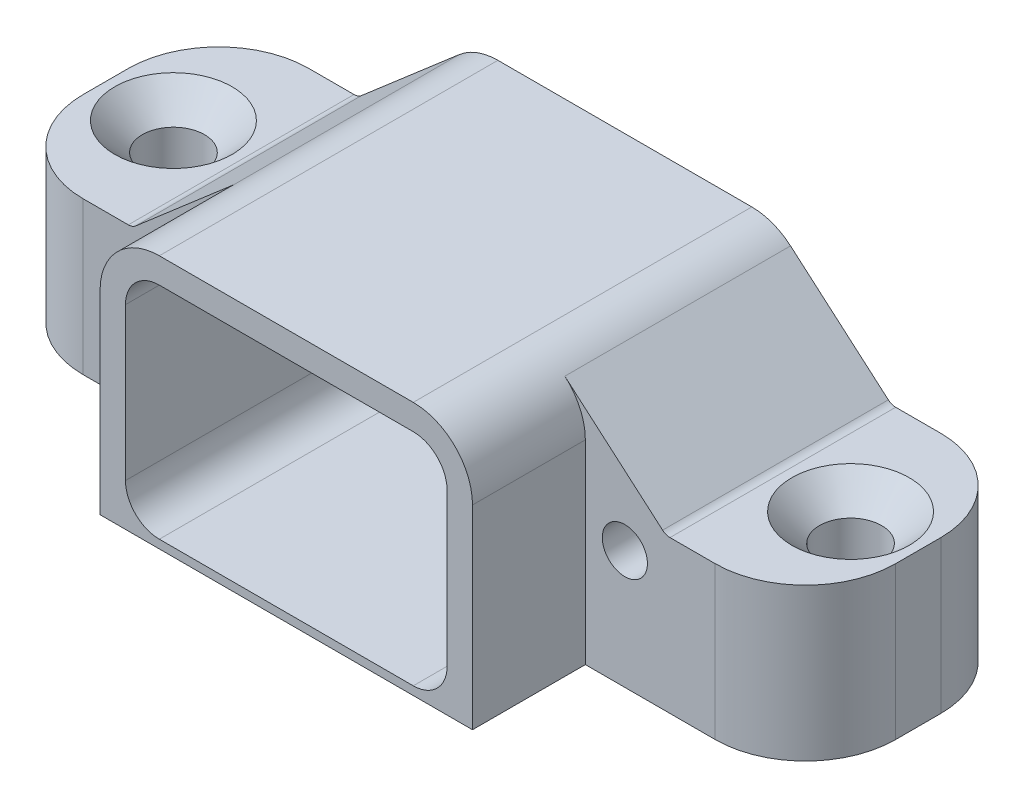
ISO-10303-21;
HEADER;
FILE_DESCRIPTION(('STEP AP214'),'2;1');
FILE_NAME('part.step','',(''),(''),'','','');
FILE_SCHEMA(('AUTOMOTIVE_DESIGN { 1 0 10303 214 1 1 1 1 }'));
ENDSEC;
DATA;
#1=APPLICATION_CONTEXT('core data for automotive mechanical design processes');
#2=APPLICATION_PROTOCOL_DEFINITION('international standard','automotive_design',2000,#1);
#3=PRODUCT_CONTEXT('',#1,'mechanical');
#4=PRODUCT('Part','Part','',(#3));
#5=PRODUCT_RELATED_PRODUCT_CATEGORY('part','',(#4));
#6=PRODUCT_DEFINITION_FORMATION('','',#4);
#7=PRODUCT_DEFINITION_CONTEXT('part definition',#1,'design');
#8=PRODUCT_DEFINITION('design','',#6,#7);
#9=PRODUCT_DEFINITION_SHAPE('','',#8);
#10=(LENGTH_UNIT() NAMED_UNIT(*) SI_UNIT(.MILLI.,.METRE.));
#11=(NAMED_UNIT(*) PLANE_ANGLE_UNIT() SI_UNIT($,.RADIAN.));
#12=(NAMED_UNIT(*) SI_UNIT($,.STERADIAN.) SOLID_ANGLE_UNIT());
#13=UNCERTAINTY_MEASURE_WITH_UNIT(LENGTH_MEASURE(1.E-05),#10,'distance_accuracy_value','');
#14=(GEOMETRIC_REPRESENTATION_CONTEXT(3) GLOBAL_UNCERTAINTY_ASSIGNED_CONTEXT((#13)) GLOBAL_UNIT_ASSIGNED_CONTEXT((#10,
#11,#12)) REPRESENTATION_CONTEXT('',''));
#15=CARTESIAN_POINT('',(0.,0.,0.));
#16=DIRECTION('',(0.,0.,1.));
#17=DIRECTION('',(1.,0.,0.));
#18=AXIS2_PLACEMENT_3D('',#15,#16,#17);
#19=CARTESIAN_POINT('',(0.,-10.5,20.));
#20=DIRECTION('',(0.,-1.,0.));
#21=DIRECTION('',(1.,0.,0.));
#22=AXIS2_PLACEMENT_3D('',#19,#20,#21);
#23=PLANE('',#22);
#24=DIRECTION('',(-1.,0.,0.));
#25=VECTOR('',#24,1.);
#26=CARTESIAN_POINT('',(0.,-10.5,20.));
#27=LINE('',#26,#25);
#28=CARTESIAN_POINT('',(-16.5,-10.5,20.));
#29=VERTEX_POINT('',#28);
#30=CARTESIAN_POINT('',(-28.,-10.5,20.));
#31=VERTEX_POINT('',#30);
#32=EDGE_CURVE('E417',#29,#31,#27,.T.);
#33=ORIENTED_EDGE('',*,*,#32,.T.);
#34=CARTESIAN_POINT('',(-28.,-10.5,12.));
#35=DIRECTION('',(0.,-1.,0.));
#36=DIRECTION('',(1.,0.,0.));
#37=AXIS2_PLACEMENT_3D('',#34,#35,#36);
#38=CIRCLE('',#37,8.);
#39=CARTESIAN_POINT('',(-36.,-10.5,12.));
#40=VERTEX_POINT('',#39);
#41=EDGE_CURVE('E49',#31,#40,#38,.T.);
#42=ORIENTED_EDGE('',*,*,#41,.T.);
#43=DIRECTION('',(0.,0.,-1.));
#44=VECTOR('',#43,1.);
#45=CARTESIAN_POINT('',(-36.,-10.5,20.));
#46=LINE('',#45,#44);
#47=CARTESIAN_POINT('',(-36.,-10.5,8.));
#48=VERTEX_POINT('',#47);
#49=EDGE_CURVE('E457',#40,#48,#46,.T.);
#50=ORIENTED_EDGE('',*,*,#49,.T.);
#51=CARTESIAN_POINT('',(-28.,-10.5,8.));
#52=DIRECTION('',(0.,-1.,0.));
#53=DIRECTION('',(1.,0.,0.));
#54=AXIS2_PLACEMENT_3D('',#51,#52,#53);
#55=CIRCLE('',#54,8.);
#56=CARTESIAN_POINT('',(-28.,-10.5,0.));
#57=VERTEX_POINT('',#56);
#58=EDGE_CURVE('E56',#48,#57,#55,.T.);
#59=ORIENTED_EDGE('',*,*,#58,.T.);
#60=DIRECTION('',(-1.,0.,0.));
#61=VECTOR('',#60,1.);
#62=CARTESIAN_POINT('',(0.,-10.5,0.));
#63=LINE('',#62,#61);
#64=CARTESIAN_POINT('',(28.,-10.5,0.));
#65=VERTEX_POINT('',#64);
#66=EDGE_CURVE('E436',#65,#57,#63,.T.);
#67=ORIENTED_EDGE('',*,*,#66,.F.);
#68=CARTESIAN_POINT('',(28.,-10.5,8.));
#69=DIRECTION('',(0.,1.,0.));
#70=DIRECTION('',(-1.,0.,0.));
#71=AXIS2_PLACEMENT_3D('',#68,#69,#70);
#72=CIRCLE('',#71,8.);
#73=CARTESIAN_POINT('',(36.,-10.5,8.));
#74=VERTEX_POINT('',#73);
#75=EDGE_CURVE('E353',#74,#65,#72,.T.);
#76=ORIENTED_EDGE('',*,*,#75,.F.);
#77=DIRECTION('',(0.,0.,-1.));
#78=VECTOR('',#77,1.);
#79=CARTESIAN_POINT('',(36.,-10.5,20.));
#80=LINE('',#79,#78);
#81=CARTESIAN_POINT('',(36.,-10.5,12.));
#82=VERTEX_POINT('',#81);
#83=EDGE_CURVE('E326',#82,#74,#80,.T.);
#84=ORIENTED_EDGE('',*,*,#83,.F.);
#85=CARTESIAN_POINT('',(28.,-10.5,12.));
#86=DIRECTION('',(0.,1.,0.));
#87=DIRECTION('',(-1.,0.,0.));
#88=AXIS2_PLACEMENT_3D('',#85,#86,#87);
#89=CIRCLE('',#88,8.);
#90=CARTESIAN_POINT('',(28.,-10.5,20.));
#91=VERTEX_POINT('',#90);
#92=EDGE_CURVE('E356',#91,#82,#89,.T.);
#93=ORIENTED_EDGE('',*,*,#92,.F.);
#94=DIRECTION('',(1.,0.,0.));
#95=VECTOR('',#94,1.);
#96=CARTESIAN_POINT('',(0.,-10.5,20.));
#97=LINE('',#96,#95);
#98=CARTESIAN_POINT('',(16.5,-10.5,20.));
#99=VERTEX_POINT('',#98);
#100=EDGE_CURVE('E292',#99,#91,#97,.T.);
#101=ORIENTED_EDGE('',*,*,#100,.F.);
#102=DIRECTION('',(0.,0.,-1.));
#103=VECTOR('',#102,1.);
#104=CARTESIAN_POINT('',(16.5,-10.5,30.));
#105=LINE('',#104,#103);
#106=CARTESIAN_POINT('',(16.5,-10.5,30.));
#107=VERTEX_POINT('',#106);
#108=EDGE_CURVE('E252',#107,#99,#105,.T.);
#109=ORIENTED_EDGE('',*,*,#108,.F.);
#110=DIRECTION('',(1.,0.,0.));
#111=VECTOR('',#110,1.);
#112=CARTESIAN_POINT('',(0.,-10.5,30.));
#113=LINE('',#112,#111);
#114=CARTESIAN_POINT('',(-16.5,-10.5,30.));
#115=VERTEX_POINT('',#114);
#116=EDGE_CURVE('E238',#115,#107,#113,.T.);
#117=ORIENTED_EDGE('',*,*,#116,.F.);
#118=DIRECTION('',(0.,0.,-1.));
#119=VECTOR('',#118,1.);
#120=CARTESIAN_POINT('',(-16.5,-10.5,30.));
#121=LINE('',#120,#119);
#122=EDGE_CURVE('E384',#115,#29,#121,.T.);
#123=ORIENTED_EDGE('',*,*,#122,.T.);
#124=EDGE_LOOP('',(#33,#42,#50,#59,#67,#76,#84,#93,#101,#109,#117,#123));
#125=FACE_BOUND('',#124,.T.);
#126=CARTESIAN_POINT('',(-30.,-10.5,10.));
#127=DIRECTION('',(0.,1.,0.));
#128=DIRECTION('',(0.,0.,1.));
#129=AXIS2_PLACEMENT_3D('',#126,#127,#128);
#130=CIRCLE('',#129,2.75);
#131=CARTESIAN_POINT('',(-30.,-10.5,12.75));
#132=VERTEX_POINT('',#131);
#133=EDGE_CURVE('E401',#132,#132,#130,.T.);
#134=ORIENTED_EDGE('',*,*,#133,.T.);
#135=EDGE_LOOP('',(#134));
#136=FACE_BOUND('',#135,.T.);
#137=CARTESIAN_POINT('',(30.,-10.5,10.));
#138=DIRECTION('',(0.,-1.,0.));
#139=DIRECTION('',(0.,0.,1.));
#140=AXIS2_PLACEMENT_3D('',#137,#138,#139);
#141=CIRCLE('',#140,2.75);
#142=CARTESIAN_POINT('',(30.,-10.5,12.75));
#143=VERTEX_POINT('',#142);
#144=EDGE_CURVE('E278',#143,#143,#141,.T.);
#145=ORIENTED_EDGE('',*,*,#144,.F.);
#146=EDGE_LOOP('',(#145));
#147=FACE_BOUND('',#146,.T.);
#148=ADVANCED_FACE('F41',(#125,#136,#147),#23,.T.);
#149=CARTESIAN_POINT('',(0.,12.,20.));
#150=DIRECTION('',(0.,-1.,0.));
#151=DIRECTION('',(1.,0.,0.));
#152=AXIS2_PLACEMENT_3D('',#149,#150,#151);
#153=PLANE('',#152);
#154=DIRECTION('',(-1.,0.,0.));
#155=VECTOR('',#154,1.);
#156=CARTESIAN_POINT('',(0.,12.,0.));
#157=LINE('',#156,#155);
#158=CARTESIAN_POINT('',(11.25,12.,0.));
#159=VERTEX_POINT('',#158);
#160=CARTESIAN_POINT('',(-11.25,12.,0.));
#161=VERTEX_POINT('',#160);
#162=EDGE_CURVE('E422',#159,#161,#157,.T.);
#163=ORIENTED_EDGE('',*,*,#162,.T.);
#164=DIRECTION('',(0.,0.,-1.));
#165=VECTOR('',#164,1.);
#166=CARTESIAN_POINT('',(-11.25,12.,20.));
#167=LINE('',#166,#165);
#168=CARTESIAN_POINT('',(-11.25,12.,30.));
#169=VERTEX_POINT('',#168);
#170=EDGE_CURVE('E389',#169,#161,#167,.T.);
#171=ORIENTED_EDGE('',*,*,#170,.F.);
#172=DIRECTION('',(-1.,0.,0.));
#173=VECTOR('',#172,1.);
#174=CARTESIAN_POINT('',(0.,12.,30.));
#175=LINE('',#174,#173);
#176=CARTESIAN_POINT('',(11.25,12.,30.));
#177=VERTEX_POINT('',#176);
#178=EDGE_CURVE('E382',#177,#169,#175,.T.);
#179=ORIENTED_EDGE('',*,*,#178,.F.);
#180=DIRECTION('',(0.,0.,-1.));
#181=VECTOR('',#180,1.);
#182=CARTESIAN_POINT('',(11.25,12.,20.));
#183=LINE('',#182,#181);
#184=EDGE_CURVE('E257',#177,#159,#183,.T.);
#185=ORIENTED_EDGE('',*,*,#184,.T.);
#186=EDGE_LOOP('',(#163,#171,#179,#185));
#187=FACE_BOUND('',#186,.T.);
#188=ADVANCED_FACE('F516',(#187),#153,.F.);
#189=CARTESIAN_POINT('',(-11.25,6.75000000000001,20.));
#190=DIRECTION('',(0.,0.,-1.));
#191=DIRECTION('',(-1.,0.,0.));
#192=AXIS2_PLACEMENT_3D('',#189,#190,#191);
#193=CYLINDRICAL_SURFACE('',#192,5.25);
#194=CARTESIAN_POINT('',(-11.25,6.75000000000001,0.));
#195=DIRECTION('',(0.,0.,1.));
#196=DIRECTION('',(1.,0.,0.));
#197=AXIS2_PLACEMENT_3D('',#194,#195,#196);
#198=CIRCLE('',#197,5.25);
#199=CARTESIAN_POINT('',(-14.6806746788275,10.7240371472913,0.));
#200=VERTEX_POINT('',#199);
#201=EDGE_CURVE('E425',#161,#200,#198,.T.);
#202=ORIENTED_EDGE('',*,*,#201,.T.);
#203=DIRECTION('',(0.,0.,-1.));
#204=VECTOR('',#203,1.);
#205=CARTESIAN_POINT('',(-14.6806746788275,10.7240371472913,20.));
#206=LINE('',#205,#204);
#207=CARTESIAN_POINT('',(-14.6806746788275,10.7240371472913,20.));
#208=VERTEX_POINT('',#207);
#209=EDGE_CURVE('E467',#208,#200,#206,.T.);
#210=ORIENTED_EDGE('',*,*,#209,.F.);
#211=CARTESIAN_POINT('',(-11.25,6.75000000000001,20.));
#212=DIRECTION('',(0.,0.,1.));
#213=DIRECTION('',(1.,0.,0.));
#214=AXIS2_PLACEMENT_3D('',#211,#212,#213);
#215=CIRCLE('',#214,5.25);
#216=CARTESIAN_POINT('',(-16.5,6.75000000000001,20.));
#217=VERTEX_POINT('',#216);
#218=EDGE_CURVE('E385',#208,#217,#215,.T.);
#219=ORIENTED_EDGE('',*,*,#218,.T.);
#220=DIRECTION('',(0.,0.,-1.));
#221=VECTOR('',#220,1.);
#222=CARTESIAN_POINT('',(-16.5,6.75000000000001,30.));
#223=LINE('',#222,#221);
#224=CARTESIAN_POINT('',(-16.5,6.75000000000001,30.));
#225=VERTEX_POINT('',#224);
#226=EDGE_CURVE('E393',#225,#217,#223,.T.);
#227=ORIENTED_EDGE('',*,*,#226,.F.);
#228=CARTESIAN_POINT('',(-11.25,6.75000000000001,30.));
#229=DIRECTION('',(0.,0.,1.));
#230=DIRECTION('',(1.,0.,0.));
#231=AXIS2_PLACEMENT_3D('',#228,#229,#230);
#232=CIRCLE('',#231,5.25);
#233=EDGE_CURVE('E362',#169,#225,#232,.T.);
#234=ORIENTED_EDGE('',*,*,#233,.F.);
#235=ORIENTED_EDGE('',*,*,#170,.T.);
#236=EDGE_LOOP('',(#202,#210,#219,#227,#234,#235));
#237=FACE_BOUND('',#236,.T.);
#238=ADVANCED_FACE('F522',(#237),#193,.T.);
#239=CARTESIAN_POINT('',(-11.5734117891573,13.4064499484192,20.));
#240=DIRECTION('',(-0.6534618435862,0.756959456626922,0.));
#241=DIRECTION('',(-0.756959456626922,-0.653461843586199,0.));
#242=AXIS2_PLACEMENT_3D('',#239,#240,#241);
#243=PLANE('',#242);
#244=DIRECTION('',(0.756959456626922,0.6534618435862,0.));
#245=VECTOR('',#244,1.);
#246=CARTESIAN_POINT('',(-11.5734117891573,13.4064499484192,0.));
#247=LINE('',#246,#245);
#248=CARTESIAN_POINT('',(-23.3465381564138,3.24304054337307,0.));
#249=VERTEX_POINT('',#248);
#250=EDGE_CURVE('E428',#249,#200,#247,.T.);
#251=ORIENTED_EDGE('',*,*,#250,.F.);
#252=DIRECTION('',(0.,0.,-1.));
#253=VECTOR('',#252,1.);
#254=CARTESIAN_POINT('',(-23.3465381564138,3.24304054337307,20.));
#255=LINE('',#254,#253);
#256=CARTESIAN_POINT('',(-23.3465381564138,3.24304054337307,20.));
#257=VERTEX_POINT('',#256);
#258=EDGE_CURVE('E465',#257,#249,#255,.T.);
#259=ORIENTED_EDGE('',*,*,#258,.F.);
#260=DIRECTION('',(0.756959456626922,0.6534618435862,0.));
#261=VECTOR('',#260,1.);
#262=CARTESIAN_POINT('',(-11.5734117891573,13.4064499484192,20.));
#263=LINE('',#262,#261);
#264=EDGE_CURVE('E408',#257,#208,#263,.T.);
#265=ORIENTED_EDGE('',*,*,#264,.T.);
#266=ORIENTED_EDGE('',*,*,#209,.T.);
#267=EDGE_LOOP('',(#251,#259,#265,#266));
#268=FACE_BOUND('',#267,.T.);
#269=ADVANCED_FACE('F536',(#268),#243,.T.);
#270=CARTESIAN_POINT('',(-24.,3.99999999999999,20.));
#271=DIRECTION('',(0.,0.,-1.));
#272=DIRECTION('',(-1.,0.,0.));
#273=AXIS2_PLACEMENT_3D('',#270,#271,#272);
#274=CYLINDRICAL_SURFACE('',#273,1.);
#275=CARTESIAN_POINT('',(-24.,3.99999999999999,0.));
#276=DIRECTION('',(0.,0.,1.));
#277=DIRECTION('',(1.,0.,0.));
#278=AXIS2_PLACEMENT_3D('',#275,#276,#277);
#279=CIRCLE('',#278,1.);
#280=CARTESIAN_POINT('',(-24.,2.99999999999999,0.));
#281=VERTEX_POINT('',#280);
#282=EDGE_CURVE('E431',#281,#249,#279,.T.);
#283=ORIENTED_EDGE('',*,*,#282,.F.);
#284=DIRECTION('',(0.,0.,-1.));
#285=VECTOR('',#284,1.);
#286=CARTESIAN_POINT('',(-24.,2.99999999999999,20.));
#287=LINE('',#286,#285);
#288=CARTESIAN_POINT('',(-24.,2.99999999999999,20.));
#289=VERTEX_POINT('',#288);
#290=EDGE_CURVE('E462',#289,#281,#287,.T.);
#291=ORIENTED_EDGE('',*,*,#290,.F.);
#292=CARTESIAN_POINT('',(-24.,3.99999999999999,20.));
#293=DIRECTION('',(0.,0.,1.));
#294=DIRECTION('',(1.,0.,0.));
#295=AXIS2_PLACEMENT_3D('',#292,#293,#294);
#296=CIRCLE('',#295,1.);
#297=EDGE_CURVE('E412',#289,#257,#296,.T.);
#298=ORIENTED_EDGE('',*,*,#297,.T.);
#299=ORIENTED_EDGE('',*,*,#258,.T.);
#300=EDGE_LOOP('',(#283,#291,#298,#299));
#301=FACE_BOUND('',#300,.T.);
#302=ADVANCED_FACE('F499',(#301),#274,.F.);
#303=CARTESIAN_POINT('',(0.,2.99999999999999,20.));
#304=DIRECTION('',(0.,1.,0.));
#305=DIRECTION('',(0.,0.,1.));
#306=AXIS2_PLACEMENT_3D('',#303,#304,#305);
#307=PLANE('',#306);
#308=CARTESIAN_POINT('',(-30.,2.99999999999999,10.));
#309=DIRECTION('',(0.,1.,0.));
#310=DIRECTION('',(0.,0.,1.));
#311=AXIS2_PLACEMENT_3D('',#308,#309,#310);
#312=CIRCLE('',#311,5.2);
#313=CARTESIAN_POINT('',(-30.,2.99999999999999,15.2));
#314=VERTEX_POINT('',#313);
#315=EDGE_CURVE('E395',#314,#314,#312,.T.);
#316=ORIENTED_EDGE('',*,*,#315,.F.);
#317=EDGE_LOOP('',(#316));
#318=FACE_BOUND('',#317,.T.);
#319=DIRECTION('',(0.,0.,-1.));
#320=VECTOR('',#319,1.);
#321=CARTESIAN_POINT('',(-36.,2.99999999999999,20.));
#322=LINE('',#321,#320);
#323=CARTESIAN_POINT('',(-36.,2.99999999999999,12.));
#324=VERTEX_POINT('',#323);
#325=CARTESIAN_POINT('',(-36.,2.99999999999999,8.));
#326=VERTEX_POINT('',#325);
#327=EDGE_CURVE('E459',#324,#326,#322,.T.);
#328=ORIENTED_EDGE('',*,*,#327,.F.);
#329=CARTESIAN_POINT('',(-28.,2.99999999999999,12.));
#330=DIRECTION('',(0.,1.,0.));
#331=DIRECTION('',(0.,0.,1.));
#332=AXIS2_PLACEMENT_3D('',#329,#330,#331);
#333=CIRCLE('',#332,8.);
#334=CARTESIAN_POINT('',(-28.,2.99999999999999,20.));
#335=VERTEX_POINT('',#334);
#336=EDGE_CURVE('E477',#324,#335,#333,.T.);
#337=ORIENTED_EDGE('',*,*,#336,.T.);
#338=DIRECTION('',(1.,0.,0.));
#339=VECTOR('',#338,1.);
#340=CARTESIAN_POINT('',(0.,2.99999999999999,20.));
#341=LINE('',#340,#339);
#342=EDGE_CURVE('E415',#335,#289,#341,.T.);
#343=ORIENTED_EDGE('',*,*,#342,.T.);
#344=ORIENTED_EDGE('',*,*,#290,.T.);
#345=DIRECTION('',(1.,0.,0.));
#346=VECTOR('',#345,1.);
#347=CARTESIAN_POINT('',(0.,2.99999999999999,0.));
#348=LINE('',#347,#346);
#349=CARTESIAN_POINT('',(-28.,2.99999999999999,0.));
#350=VERTEX_POINT('',#349);
#351=EDGE_CURVE('E434',#350,#281,#348,.T.);
#352=ORIENTED_EDGE('',*,*,#351,.F.);
#353=CARTESIAN_POINT('',(-28.,2.99999999999999,8.));
#354=DIRECTION('',(0.,1.,0.));
#355=DIRECTION('',(0.,0.,1.));
#356=AXIS2_PLACEMENT_3D('',#353,#354,#355);
#357=CIRCLE('',#356,8.);
#358=EDGE_CURVE('E475',#350,#326,#357,.T.);
#359=ORIENTED_EDGE('',*,*,#358,.T.);
#360=EDGE_LOOP('',(#328,#337,#343,#344,#352,#359));
#361=FACE_BOUND('',#360,.T.);
#362=ADVANCED_FACE('F491',(#318,#361),#307,.T.);
#363=CARTESIAN_POINT('',(-36.,0.,20.));
#364=DIRECTION('',(-1.,0.,0.));
#365=DIRECTION('',(0.,0.,1.));
#366=AXIS2_PLACEMENT_3D('',#363,#364,#365);
#367=PLANE('',#366);
#368=ORIENTED_EDGE('',*,*,#49,.F.);
#369=DIRECTION('',(0.,1.,0.));
#370=VECTOR('',#369,1.);
#371=CARTESIAN_POINT('',(-36.,0.,12.));
#372=LINE('',#371,#370);
#373=EDGE_CURVE('E472',#40,#324,#372,.T.);
#374=ORIENTED_EDGE('',*,*,#373,.T.);
#375=ORIENTED_EDGE('',*,*,#327,.T.);
#376=DIRECTION('',(0.,1.,0.));
#377=VECTOR('',#376,1.);
#378=CARTESIAN_POINT('',(-36.,-10.5,8.));
#379=LINE('',#378,#377);
#380=EDGE_CURVE('E388',#326,#48,#379,.F.);
#381=ORIENTED_EDGE('',*,*,#380,.T.);
#382=EDGE_LOOP('',(#368,#374,#375,#381));
#383=FACE_BOUND('',#382,.T.);
#384=ADVANCED_FACE('F486',(#383),#367,.T.);
#385=CARTESIAN_POINT('',(0.,-9.74999999999999,20.));
#386=DIRECTION('',(0.,1.,0.));
#387=DIRECTION('',(-1.,0.,0.));
#388=AXIS2_PLACEMENT_3D('',#385,#386,#387);
#389=PLANE('',#388);
#390=DIRECTION('',(1.,0.,0.));
#391=VECTOR('',#390,1.);
#392=CARTESIAN_POINT('',(0.,-9.74999999999999,0.));
#393=LINE('',#392,#391);
#394=CARTESIAN_POINT('',(-11.25,-9.74999999999999,0.));
#395=VERTEX_POINT('',#394);
#396=CARTESIAN_POINT('',(11.25,-9.74999999999999,0.));
#397=VERTEX_POINT('',#396);
#398=EDGE_CURVE('E438',#395,#397,#393,.T.);
#399=ORIENTED_EDGE('',*,*,#398,.F.);
#400=DIRECTION('',(0.,0.,-1.));
#401=VECTOR('',#400,1.);
#402=CARTESIAN_POINT('',(-11.25,-9.74999999999999,20.));
#403=LINE('',#402,#401);
#404=CARTESIAN_POINT('',(-11.25,-9.74999999999999,30.));
#405=VERTEX_POINT('',#404);
#406=EDGE_CURVE('E455',#405,#395,#403,.T.);
#407=ORIENTED_EDGE('',*,*,#406,.F.);
#408=DIRECTION('',(-1.,0.,0.));
#409=VECTOR('',#408,1.);
#410=CARTESIAN_POINT('',(0.,-9.74999999999999,30.));
#411=LINE('',#410,#409);
#412=CARTESIAN_POINT('',(11.25,-9.74999999999999,30.));
#413=VERTEX_POINT('',#412);
#414=EDGE_CURVE('E368',#413,#405,#411,.T.);
#415=ORIENTED_EDGE('',*,*,#414,.F.);
#416=DIRECTION('',(0.,0.,-1.));
#417=VECTOR('',#416,1.);
#418=CARTESIAN_POINT('',(11.25,-9.74999999999999,20.));
#419=LINE('',#418,#417);
#420=EDGE_CURVE('E323',#413,#397,#419,.T.);
#421=ORIENTED_EDGE('',*,*,#420,.T.);
#422=EDGE_LOOP('',(#399,#407,#415,#421));
#423=FACE_BOUND('',#422,.T.);
#424=ADVANCED_FACE('F527',(#423),#389,.T.);
#425=CARTESIAN_POINT('',(-11.25,-6.74999999999999,20.));
#426=DIRECTION('',(0.,0.,-1.));
#427=DIRECTION('',(-1.,0.,0.));
#428=AXIS2_PLACEMENT_3D('',#425,#426,#427);
#429=CYLINDRICAL_SURFACE('',#428,3.);
#430=CARTESIAN_POINT('',(-11.25,-6.74999999999999,0.));
#431=DIRECTION('',(0.,0.,1.));
#432=DIRECTION('',(1.,0.,0.));
#433=AXIS2_PLACEMENT_3D('',#430,#431,#432);
#434=CIRCLE('',#433,3.);
#435=CARTESIAN_POINT('',(-14.25,-6.74999999999999,0.));
#436=VERTEX_POINT('',#435);
#437=EDGE_CURVE('E440',#395,#436,#434,.F.);
#438=ORIENTED_EDGE('',*,*,#437,.T.);
#439=DIRECTION('',(0.,0.,-1.));
#440=VECTOR('',#439,1.);
#441=CARTESIAN_POINT('',(-14.25,-6.74999999999999,20.));
#442=LINE('',#441,#440);
#443=CARTESIAN_POINT('',(-14.25,-6.74999999999999,30.));
#444=VERTEX_POINT('',#443);
#445=EDGE_CURVE('E452',#444,#436,#442,.T.);
#446=ORIENTED_EDGE('',*,*,#445,.F.);
#447=CARTESIAN_POINT('',(-11.25,-6.74999999999999,30.));
#448=DIRECTION('',(0.,0.,1.));
#449=DIRECTION('',(1.,0.,0.));
#450=AXIS2_PLACEMENT_3D('',#447,#448,#449);
#451=CIRCLE('',#450,3.);
#452=EDGE_CURVE('E371',#405,#444,#451,.F.);
#453=ORIENTED_EDGE('',*,*,#452,.F.);
#454=ORIENTED_EDGE('',*,*,#406,.T.);
#455=EDGE_LOOP('',(#438,#446,#453,#454));
#456=FACE_BOUND('',#455,.T.);
#457=ADVANCED_FACE('F615',(#456),#429,.F.);
#458=CARTESIAN_POINT('',(-14.25,0.,20.));
#459=DIRECTION('',(-1.,0.,0.));
#460=DIRECTION('',(0.,-1.,0.));
#461=AXIS2_PLACEMENT_3D('',#458,#459,#460);
#462=PLANE('',#461);
#463=DIRECTION('',(0.,1.,0.));
#464=VECTOR('',#463,1.);
#465=CARTESIAN_POINT('',(-14.25,0.,0.));
#466=LINE('',#465,#464);
#467=CARTESIAN_POINT('',(-14.25,6.75000000000001,0.));
#468=VERTEX_POINT('',#467);
#469=EDGE_CURVE('E442',#436,#468,#466,.T.);
#470=ORIENTED_EDGE('',*,*,#469,.T.);
#471=DIRECTION('',(0.,0.,-1.));
#472=VECTOR('',#471,1.);
#473=CARTESIAN_POINT('',(-14.25,6.75000000000001,20.));
#474=LINE('',#473,#472);
#475=CARTESIAN_POINT('',(-14.25,6.75000000000001,30.));
#476=VERTEX_POINT('',#475);
#477=EDGE_CURVE('E449',#476,#468,#474,.T.);
#478=ORIENTED_EDGE('',*,*,#477,.F.);
#479=DIRECTION('',(0.,1.,0.));
#480=VECTOR('',#479,1.);
#481=CARTESIAN_POINT('',(-14.25,0.,30.));
#482=LINE('',#481,#480);
#483=EDGE_CURVE('E374',#444,#476,#482,.T.);
#484=ORIENTED_EDGE('',*,*,#483,.F.);
#485=ORIENTED_EDGE('',*,*,#445,.T.);
#486=EDGE_LOOP('',(#470,#478,#484,#485));
#487=FACE_BOUND('',#486,.T.);
#488=ADVANCED_FACE('F612',(#487),#462,.F.);
#489=CARTESIAN_POINT('',(-11.25,6.75000000000001,20.));
#490=DIRECTION('',(0.,0.,-1.));
#491=DIRECTION('',(-1.,0.,0.));
#492=AXIS2_PLACEMENT_3D('',#489,#490,#491);
#493=CYLINDRICAL_SURFACE('',#492,3.);
#494=CARTESIAN_POINT('',(-11.25,6.75000000000001,0.));
#495=DIRECTION('',(0.,0.,1.));
#496=DIRECTION('',(1.,0.,0.));
#497=AXIS2_PLACEMENT_3D('',#494,#495,#496);
#498=CIRCLE('',#497,3.);
#499=CARTESIAN_POINT('',(-11.25,9.75000000000001,0.));
#500=VERTEX_POINT('',#499);
#501=EDGE_CURVE('E444',#468,#500,#498,.F.);
#502=ORIENTED_EDGE('',*,*,#501,.T.);
#503=DIRECTION('',(0.,0.,-1.));
#504=VECTOR('',#503,1.);
#505=CARTESIAN_POINT('',(-11.25,9.75000000000001,20.));
#506=LINE('',#505,#504);
#507=CARTESIAN_POINT('',(-11.25,9.75000000000001,30.));
#508=VERTEX_POINT('',#507);
#509=EDGE_CURVE('E419',#508,#500,#506,.T.);
#510=ORIENTED_EDGE('',*,*,#509,.F.);
#511=CARTESIAN_POINT('',(-11.25,6.75000000000001,30.));
#512=DIRECTION('',(0.,0.,1.));
#513=DIRECTION('',(1.,0.,0.));
#514=AXIS2_PLACEMENT_3D('',#511,#512,#513);
#515=CIRCLE('',#514,3.);
#516=EDGE_CURVE('E377',#476,#508,#515,.F.);
#517=ORIENTED_EDGE('',*,*,#516,.F.);
#518=ORIENTED_EDGE('',*,*,#477,.T.);
#519=EDGE_LOOP('',(#502,#510,#517,#518));
#520=FACE_BOUND('',#519,.T.);
#521=ADVANCED_FACE('F553',(#520),#493,.F.);
#522=CARTESIAN_POINT('',(0.,9.75000000000001,20.));
#523=DIRECTION('',(0.,1.,0.));
#524=DIRECTION('',(-1.,0.,0.));
#525=AXIS2_PLACEMENT_3D('',#522,#523,#524);
#526=PLANE('',#525);
#527=DIRECTION('',(1.,0.,0.));
#528=VECTOR('',#527,1.);
#529=CARTESIAN_POINT('',(0.,9.75000000000001,0.));
#530=LINE('',#529,#528);
#531=CARTESIAN_POINT('',(11.25,9.75000000000001,0.));
#532=VERTEX_POINT('',#531);
#533=EDGE_CURVE('E409',#500,#532,#530,.T.);
#534=ORIENTED_EDGE('',*,*,#533,.T.);
#535=DIRECTION('',(0.,0.,-1.));
#536=VECTOR('',#535,1.);
#537=CARTESIAN_POINT('',(11.25,9.75000000000001,20.));
#538=LINE('',#537,#536);
#539=CARTESIAN_POINT('',(11.25,9.75000000000001,30.));
#540=VERTEX_POINT('',#539);
#541=EDGE_CURVE('E295',#540,#532,#538,.T.);
#542=ORIENTED_EDGE('',*,*,#541,.F.);
#543=DIRECTION('',(1.,0.,0.));
#544=VECTOR('',#543,1.);
#545=CARTESIAN_POINT('',(0.,9.75000000000001,30.));
#546=LINE('',#545,#544);
#547=EDGE_CURVE('E380',#508,#540,#546,.T.);
#548=ORIENTED_EDGE('',*,*,#547,.F.);
#549=ORIENTED_EDGE('',*,*,#509,.T.);
#550=EDGE_LOOP('',(#534,#542,#548,#549));
#551=FACE_BOUND('',#550,.T.);
#552=ADVANCED_FACE('F545',(#551),#526,.F.);
#553=CARTESIAN_POINT('',(-20.,0.,20.));
#554=DIRECTION('',(0.,0.,-1.));
#555=DIRECTION('',(-1.,0.,0.));
#556=AXIS2_PLACEMENT_3D('',#553,#554,#555);
#557=CYLINDRICAL_SURFACE('',#556,2.);
#558=CARTESIAN_POINT('',(-20.,0.,20.));
#559=DIRECTION('',(0.,0.,1.));
#560=DIRECTION('',(1.,0.,0.));
#561=AXIS2_PLACEMENT_3D('',#558,#559,#560);
#562=CIRCLE('',#561,2.);
#563=CARTESIAN_POINT('',(-18.,0.,20.));
#564=VERTEX_POINT('',#563);
#565=EDGE_CURVE('E405',#564,#564,#562,.T.);
#566=ORIENTED_EDGE('',*,*,#565,.T.);
#567=EDGE_LOOP('',(#566));
#568=FACE_BOUND('',#567,.T.);
#569=CARTESIAN_POINT('',(-20.,0.,0.));
#570=DIRECTION('',(0.,0.,1.));
#571=DIRECTION('',(1.,0.,0.));
#572=AXIS2_PLACEMENT_3D('',#569,#570,#571);
#573=CIRCLE('',#572,2.);
#574=CARTESIAN_POINT('',(-18.,0.,0.));
#575=VERTEX_POINT('',#574);
#576=EDGE_CURVE('E404',#575,#575,#573,.T.);
#577=ORIENTED_EDGE('',*,*,#576,.F.);
#578=EDGE_LOOP('',(#577));
#579=FACE_BOUND('',#578,.T.);
#580=ADVANCED_FACE('F543',(#568,#579),#557,.F.);
#581=CARTESIAN_POINT('',(0.,0.,20.));
#582=DIRECTION('',(0.,0.,1.));
#583=DIRECTION('',(1.,0.,0.));
#584=AXIS2_PLACEMENT_3D('',#581,#582,#583);
#585=PLANE('',#584);
#586=ORIENTED_EDGE('',*,*,#342,.F.);
#587=DIRECTION('',(0.,1.,0.));
#588=VECTOR('',#587,1.);
#589=CARTESIAN_POINT('',(-28.,0.,20.));
#590=LINE('',#589,#588);
#591=EDGE_CURVE('E64',#335,#31,#590,.F.);
#592=ORIENTED_EDGE('',*,*,#591,.T.);
#593=ORIENTED_EDGE('',*,*,#32,.F.);
#594=DIRECTION('',(0.,1.,0.));
#595=VECTOR('',#594,1.);
#596=CARTESIAN_POINT('',(-16.5,0.,20.));
#597=LINE('',#596,#595);
#598=EDGE_CURVE('E361',#29,#217,#597,.T.);
#599=ORIENTED_EDGE('',*,*,#598,.T.);
#600=ORIENTED_EDGE('',*,*,#218,.F.);
#601=ORIENTED_EDGE('',*,*,#264,.F.);
#602=ORIENTED_EDGE('',*,*,#297,.F.);
#603=EDGE_LOOP('',(#586,#592,#593,#599,#600,#601,#602));
#604=FACE_BOUND('',#603,.T.);
#605=ORIENTED_EDGE('',*,*,#565,.F.);
#606=EDGE_LOOP('',(#605));
#607=FACE_BOUND('',#606,.T.);
#608=ADVANCED_FACE('F494',(#604,#607),#585,.T.);
#609=CARTESIAN_POINT('',(0.,0.,0.));
#610=DIRECTION('',(0.,0.,1.));
#611=DIRECTION('',(1.,0.,0.));
#612=AXIS2_PLACEMENT_3D('',#609,#610,#611);
#613=PLANE('',#612);
#614=DIRECTION('',(0.,1.,0.));
#615=VECTOR('',#614,1.);
#616=CARTESIAN_POINT('',(28.,2.99999999999999,0.));
#617=LINE('',#616,#615);
#618=CARTESIAN_POINT('',(28.,2.99999999999999,0.));
#619=VERTEX_POINT('',#618);
#620=EDGE_CURVE('E359',#65,#619,#617,.T.);
#621=ORIENTED_EDGE('',*,*,#620,.F.);
#622=ORIENTED_EDGE('',*,*,#66,.T.);
#623=DIRECTION('',(0.,1.,0.));
#624=VECTOR('',#623,1.);
#625=CARTESIAN_POINT('',(-28.,2.99999999999999,0.));
#626=LINE('',#625,#624);
#627=EDGE_CURVE('E11',#57,#350,#626,.T.);
#628=ORIENTED_EDGE('',*,*,#627,.T.);
#629=ORIENTED_EDGE('',*,*,#351,.T.);
#630=ORIENTED_EDGE('',*,*,#282,.T.);
#631=ORIENTED_EDGE('',*,*,#250,.T.);
#632=ORIENTED_EDGE('',*,*,#201,.F.);
#633=ORIENTED_EDGE('',*,*,#162,.F.);
#634=CARTESIAN_POINT('',(11.25,6.75000000000001,0.));
#635=DIRECTION('',(0.,0.,-1.));
#636=DIRECTION('',(-1.,0.,0.));
#637=AXIS2_PLACEMENT_3D('',#634,#635,#636);
#638=CIRCLE('',#637,5.25);
#639=CARTESIAN_POINT('',(14.6806746788275,10.7240371472913,0.));
#640=VERTEX_POINT('',#639);
#641=EDGE_CURVE('E298',#159,#640,#638,.T.);
#642=ORIENTED_EDGE('',*,*,#641,.T.);
#643=DIRECTION('',(-0.756959456626922,0.6534618435862,0.));
#644=VECTOR('',#643,1.);
#645=CARTESIAN_POINT('',(11.5734117891573,13.4064499484192,0.));
#646=LINE('',#645,#644);
#647=CARTESIAN_POINT('',(23.3465381564138,3.24304054337307,0.));
#648=VERTEX_POINT('',#647);
#649=EDGE_CURVE('E301',#648,#640,#646,.T.);
#650=ORIENTED_EDGE('',*,*,#649,.F.);
#651=CARTESIAN_POINT('',(24.,3.99999999999999,0.));
#652=DIRECTION('',(0.,0.,-1.));
#653=DIRECTION('',(-1.,0.,0.));
#654=AXIS2_PLACEMENT_3D('',#651,#652,#653);
#655=CIRCLE('',#654,1.);
#656=CARTESIAN_POINT('',(24.,2.99999999999999,0.));
#657=VERTEX_POINT('',#656);
#658=EDGE_CURVE('E303',#657,#648,#655,.T.);
#659=ORIENTED_EDGE('',*,*,#658,.F.);
#660=DIRECTION('',(-1.,0.,0.));
#661=VECTOR('',#660,1.);
#662=CARTESIAN_POINT('',(0.,2.99999999999999,0.));
#663=LINE('',#662,#661);
#664=EDGE_CURVE('E305',#619,#657,#663,.T.);
#665=ORIENTED_EDGE('',*,*,#664,.F.);
#666=EDGE_LOOP('',(#621,#622,#628,#629,#630,#631,#632,#633,#642,#650,#659,#665));
#667=FACE_BOUND('',#666,.T.);
#668=ORIENTED_EDGE('',*,*,#576,.T.);
#669=EDGE_LOOP('',(#668));
#670=FACE_BOUND('',#669,.T.);
#671=ORIENTED_EDGE('',*,*,#398,.T.);
#672=CARTESIAN_POINT('',(11.25,-6.74999999999999,0.));
#673=DIRECTION('',(0.,0.,-1.));
#674=DIRECTION('',(-1.,0.,0.));
#675=AXIS2_PLACEMENT_3D('',#672,#673,#674);
#676=CIRCLE('',#675,3.);
#677=CARTESIAN_POINT('',(14.25,-6.74999999999999,0.));
#678=VERTEX_POINT('',#677);
#679=EDGE_CURVE('E307',#397,#678,#676,.F.);
#680=ORIENTED_EDGE('',*,*,#679,.T.);
#681=DIRECTION('',(0.,1.,0.));
#682=VECTOR('',#681,1.);
#683=CARTESIAN_POINT('',(14.25,0.,0.));
#684=LINE('',#683,#682);
#685=CARTESIAN_POINT('',(14.25,6.75000000000001,0.));
#686=VERTEX_POINT('',#685);
#687=EDGE_CURVE('E310',#678,#686,#684,.T.);
#688=ORIENTED_EDGE('',*,*,#687,.T.);
#689=CARTESIAN_POINT('',(11.25,6.75000000000001,0.));
#690=DIRECTION('',(0.,0.,-1.));
#691=DIRECTION('',(-1.,0.,0.));
#692=AXIS2_PLACEMENT_3D('',#689,#690,#691);
#693=CIRCLE('',#692,3.);
#694=EDGE_CURVE('E286',#686,#532,#693,.F.);
#695=ORIENTED_EDGE('',*,*,#694,.T.);
#696=ORIENTED_EDGE('',*,*,#533,.F.);
#697=ORIENTED_EDGE('',*,*,#501,.F.);
#698=ORIENTED_EDGE('',*,*,#469,.F.);
#699=ORIENTED_EDGE('',*,*,#437,.F.);
#700=EDGE_LOOP('',(#671,#680,#688,#695,#696,#697,#698,#699));
#701=FACE_BOUND('',#700,.T.);
#702=CARTESIAN_POINT('',(20.,0.,0.));
#703=DIRECTION('',(0.,0.,-1.));
#704=DIRECTION('',(-1.,0.,0.));
#705=AXIS2_PLACEMENT_3D('',#702,#703,#704);
#706=CIRCLE('',#705,2.);
#707=CARTESIAN_POINT('',(18.,0.,0.));
#708=VERTEX_POINT('',#707);
#709=EDGE_CURVE('E281',#708,#708,#706,.T.);
#710=ORIENTED_EDGE('',*,*,#709,.F.);
#711=EDGE_LOOP('',(#710));
#712=FACE_BOUND('',#711,.T.);
#713=ADVANCED_FACE('F504',(#667,#670,#701,#712),#613,.F.);
#714=CARTESIAN_POINT('',(-30.,2.99999999999999,10.));
#715=DIRECTION('',(0.,1.,0.));
#716=DIRECTION('',(0.,0.,1.));
#717=AXIS2_PLACEMENT_3D('',#714,#715,#716);
#718=CYLINDRICAL_SURFACE('',#717,2.75);
#719=ORIENTED_EDGE('',*,*,#133,.F.);
#720=EDGE_LOOP('',(#719));
#721=FACE_BOUND('',#720,.T.);
#722=CARTESIAN_POINT('',(-30.,0.549999999999988,10.));
#723=DIRECTION('',(0.,1.,0.));
#724=DIRECTION('',(0.,0.,1.));
#725=AXIS2_PLACEMENT_3D('',#722,#723,#724);
#726=CIRCLE('',#725,2.75);
#727=CARTESIAN_POINT('',(-30.,0.549999999999988,12.75));
#728=VERTEX_POINT('',#727);
#729=EDGE_CURVE('E398',#728,#728,#726,.T.);
#730=ORIENTED_EDGE('',*,*,#729,.T.);
#731=EDGE_LOOP('',(#730));
#732=FACE_BOUND('',#731,.T.);
#733=ADVANCED_FACE('F561',(#721,#732),#718,.F.);
#734=CARTESIAN_POINT('',(-30.,2.99999999999999,10.));
#735=DIRECTION('',(0.,1.,0.));
#736=DIRECTION('',(0.,0.,1.));
#737=AXIS2_PLACEMENT_3D('',#734,#735,#736);
#738=CONICAL_SURFACE('',#737,5.2,0.785398163397448);
#739=ORIENTED_EDGE('',*,*,#729,.F.);
#740=EDGE_LOOP('',(#739));
#741=FACE_BOUND('',#740,.T.);
#742=ORIENTED_EDGE('',*,*,#315,.T.);
#743=EDGE_LOOP('',(#742));
#744=FACE_BOUND('',#743,.T.);
#745=ADVANCED_FACE('F602',(#741,#744),#738,.F.);
#746=CARTESIAN_POINT('',(-16.5,0.,30.));
#747=DIRECTION('',(-1.,0.,0.));
#748=DIRECTION('',(0.,0.,1.));
#749=AXIS2_PLACEMENT_3D('',#746,#747,#748);
#750=PLANE('',#749);
#751=ORIENTED_EDGE('',*,*,#598,.F.);
#752=ORIENTED_EDGE('',*,*,#122,.F.);
#753=DIRECTION('',(0.,1.,0.));
#754=VECTOR('',#753,1.);
#755=CARTESIAN_POINT('',(-16.5,0.,30.));
#756=LINE('',#755,#754);
#757=EDGE_CURVE('E364',#115,#225,#756,.T.);
#758=ORIENTED_EDGE('',*,*,#757,.T.);
#759=ORIENTED_EDGE('',*,*,#226,.T.);
#760=EDGE_LOOP('',(#751,#752,#758,#759));
#761=FACE_BOUND('',#760,.T.);
#762=ADVANCED_FACE('F598',(#761),#750,.T.);
#763=CARTESIAN_POINT('',(0.,0.,30.));
#764=DIRECTION('',(0.,0.,1.));
#765=DIRECTION('',(1.,0.,0.));
#766=AXIS2_PLACEMENT_3D('',#763,#764,#765);
#767=PLANE('',#766);
#768=CARTESIAN_POINT('',(11.25,-6.74999999999999,30.));
#769=DIRECTION('',(0.,0.,-1.));
#770=DIRECTION('',(-1.,0.,0.));
#771=AXIS2_PLACEMENT_3D('',#768,#769,#770);
#772=CIRCLE('',#771,3.);
#773=CARTESIAN_POINT('',(14.25,-6.74999999999999,30.));
#774=VERTEX_POINT('',#773);
#775=EDGE_CURVE('E242',#413,#774,#772,.F.);
#776=ORIENTED_EDGE('',*,*,#775,.F.);
#777=ORIENTED_EDGE('',*,*,#414,.T.);
#778=ORIENTED_EDGE('',*,*,#452,.T.);
#779=ORIENTED_EDGE('',*,*,#483,.T.);
#780=ORIENTED_EDGE('',*,*,#516,.T.);
#781=ORIENTED_EDGE('',*,*,#547,.T.);
#782=CARTESIAN_POINT('',(11.25,6.75000000000001,30.));
#783=DIRECTION('',(0.,0.,-1.));
#784=DIRECTION('',(-1.,0.,0.));
#785=AXIS2_PLACEMENT_3D('',#782,#783,#784);
#786=CIRCLE('',#785,3.);
#787=CARTESIAN_POINT('',(14.25,6.75000000000001,30.));
#788=VERTEX_POINT('',#787);
#789=EDGE_CURVE('E266',#788,#540,#786,.F.);
#790=ORIENTED_EDGE('',*,*,#789,.F.);
#791=DIRECTION('',(0.,1.,0.));
#792=VECTOR('',#791,1.);
#793=CARTESIAN_POINT('',(14.25,0.,30.));
#794=LINE('',#793,#792);
#795=EDGE_CURVE('E263',#774,#788,#794,.T.);
#796=ORIENTED_EDGE('',*,*,#795,.F.);
#797=EDGE_LOOP('',(#776,#777,#778,#779,#780,#781,#790,#796));
#798=FACE_BOUND('',#797,.T.);
#799=ORIENTED_EDGE('',*,*,#233,.T.);
#800=ORIENTED_EDGE('',*,*,#757,.F.);
#801=ORIENTED_EDGE('',*,*,#116,.T.);
#802=DIRECTION('',(0.,1.,0.));
#803=VECTOR('',#802,1.);
#804=CARTESIAN_POINT('',(16.5,0.,30.));
#805=LINE('',#804,#803);
#806=CARTESIAN_POINT('',(16.5,6.75000000000001,30.));
#807=VERTEX_POINT('',#806);
#808=EDGE_CURVE('E229',#107,#807,#805,.T.);
#809=ORIENTED_EDGE('',*,*,#808,.T.);
#810=CARTESIAN_POINT('',(11.25,6.75000000000001,30.));
#811=DIRECTION('',(0.,0.,-1.));
#812=DIRECTION('',(-1.,0.,0.));
#813=AXIS2_PLACEMENT_3D('',#810,#811,#812);
#814=CIRCLE('',#813,5.25);
#815=EDGE_CURVE('E234',#177,#807,#814,.T.);
#816=ORIENTED_EDGE('',*,*,#815,.F.);
#817=ORIENTED_EDGE('',*,*,#178,.T.);
#818=EDGE_LOOP('',(#799,#800,#801,#809,#816,#817));
#819=FACE_BOUND('',#818,.T.);
#820=ADVANCED_FACE('F231',(#798,#819),#767,.T.);
#821=CARTESIAN_POINT('',(-28.,0.,12.));
#822=DIRECTION('',(0.,1.,0.));
#823=DIRECTION('',(0.,0.,1.));
#824=AXIS2_PLACEMENT_3D('',#821,#822,#823);
#825=CYLINDRICAL_SURFACE('',#824,8.);
#826=ORIENTED_EDGE('',*,*,#41,.F.);
#827=ORIENTED_EDGE('',*,*,#591,.F.);
#828=ORIENTED_EDGE('',*,*,#336,.F.);
#829=ORIENTED_EDGE('',*,*,#373,.F.);
#830=EDGE_LOOP('',(#826,#827,#828,#829));
#831=FACE_BOUND('',#830,.T.);
#832=ADVANCED_FACE('F489',(#831),#825,.T.);
#833=CARTESIAN_POINT('',(-28.,0.,8.));
#834=DIRECTION('',(0.,-1.,0.));
#835=DIRECTION('',(0.,0.,-1.));
#836=AXIS2_PLACEMENT_3D('',#833,#834,#835);
#837=CYLINDRICAL_SURFACE('',#836,8.);
#838=ORIENTED_EDGE('',*,*,#58,.F.);
#839=ORIENTED_EDGE('',*,*,#380,.F.);
#840=ORIENTED_EDGE('',*,*,#358,.F.);
#841=ORIENTED_EDGE('',*,*,#627,.F.);
#842=EDGE_LOOP('',(#838,#839,#840,#841));
#843=FACE_BOUND('',#842,.T.);
#844=ADVANCED_FACE('F43',(#843),#837,.T.);
#845=CARTESIAN_POINT('',(11.25,6.75000000000001,20.));
#846=DIRECTION('',(0.,0.,-1.));
#847=DIRECTION('',(1.,0.,0.));
#848=AXIS2_PLACEMENT_3D('',#845,#846,#847);
#849=CYLINDRICAL_SURFACE('',#848,5.25);
#850=ORIENTED_EDGE('',*,*,#641,.F.);
#851=ORIENTED_EDGE('',*,*,#184,.F.);
#852=ORIENTED_EDGE('',*,*,#815,.T.);
#853=DIRECTION('',(0.,0.,-1.));
#854=VECTOR('',#853,1.);
#855=CARTESIAN_POINT('',(16.5,6.75000000000001,30.));
#856=LINE('',#855,#854);
#857=CARTESIAN_POINT('',(16.5,6.75000000000001,20.));
#858=VERTEX_POINT('',#857);
#859=EDGE_CURVE('E245',#807,#858,#856,.T.);
#860=ORIENTED_EDGE('',*,*,#859,.T.);
#861=CARTESIAN_POINT('',(11.25,6.75000000000001,20.));
#862=DIRECTION('',(0.,0.,-1.));
#863=DIRECTION('',(-1.,0.,0.));
#864=AXIS2_PLACEMENT_3D('',#861,#862,#863);
#865=CIRCLE('',#864,5.25);
#866=CARTESIAN_POINT('',(14.6806746788275,10.7240371472913,20.));
#867=VERTEX_POINT('',#866);
#868=EDGE_CURVE('E269',#867,#858,#865,.T.);
#869=ORIENTED_EDGE('',*,*,#868,.F.);
#870=DIRECTION('',(0.,0.,-1.));
#871=VECTOR('',#870,1.);
#872=CARTESIAN_POINT('',(14.6806746788275,10.7240371472913,20.));
#873=LINE('',#872,#871);
#874=EDGE_CURVE('E338',#867,#640,#873,.T.);
#875=ORIENTED_EDGE('',*,*,#874,.T.);
#876=EDGE_LOOP('',(#850,#851,#852,#860,#869,#875));
#877=FACE_BOUND('',#876,.T.);
#878=ADVANCED_FACE('F255',(#877),#849,.T.);
#879=CARTESIAN_POINT('',(11.5734117891573,13.4064499484192,20.));
#880=DIRECTION('',(0.6534618435862,0.756959456626922,0.));
#881=DIRECTION('',(0.756959456626922,-0.653461843586199,0.));
#882=AXIS2_PLACEMENT_3D('',#879,#880,#881);
#883=PLANE('',#882);
#884=ORIENTED_EDGE('',*,*,#649,.T.);
#885=ORIENTED_EDGE('',*,*,#874,.F.);
#886=DIRECTION('',(-0.756959456626922,0.6534618435862,0.));
#887=VECTOR('',#886,1.);
#888=CARTESIAN_POINT('',(11.5734117891573,13.4064499484192,20.));
#889=LINE('',#888,#887);
#890=CARTESIAN_POINT('',(23.3465381564138,3.24304054337307,20.));
#891=VERTEX_POINT('',#890);
#892=EDGE_CURVE('E285',#891,#867,#889,.T.);
#893=ORIENTED_EDGE('',*,*,#892,.F.);
#894=DIRECTION('',(0.,0.,-1.));
#895=VECTOR('',#894,1.);
#896=CARTESIAN_POINT('',(23.3465381564138,3.24304054337307,20.));
#897=LINE('',#896,#895);
#898=EDGE_CURVE('E335',#891,#648,#897,.T.);
#899=ORIENTED_EDGE('',*,*,#898,.T.);
#900=EDGE_LOOP('',(#884,#885,#893,#899));
#901=FACE_BOUND('',#900,.T.);
#902=ADVANCED_FACE('F513',(#901),#883,.T.);
#903=CARTESIAN_POINT('',(24.,3.99999999999999,20.));
#904=DIRECTION('',(0.,0.,-1.));
#905=DIRECTION('',(1.,0.,0.));
#906=AXIS2_PLACEMENT_3D('',#903,#904,#905);
#907=CYLINDRICAL_SURFACE('',#906,1.);
#908=ORIENTED_EDGE('',*,*,#658,.T.);
#909=ORIENTED_EDGE('',*,*,#898,.F.);
#910=CARTESIAN_POINT('',(24.,3.99999999999999,20.));
#911=DIRECTION('',(0.,0.,-1.));
#912=DIRECTION('',(-1.,0.,0.));
#913=AXIS2_PLACEMENT_3D('',#910,#911,#912);
#914=CIRCLE('',#913,1.);
#915=CARTESIAN_POINT('',(24.,2.99999999999999,20.));
#916=VERTEX_POINT('',#915);
#917=EDGE_CURVE('E288',#916,#891,#914,.T.);
#918=ORIENTED_EDGE('',*,*,#917,.F.);
#919=DIRECTION('',(0.,0.,-1.));
#920=VECTOR('',#919,1.);
#921=CARTESIAN_POINT('',(24.,2.99999999999999,20.));
#922=LINE('',#921,#920);
#923=EDGE_CURVE('E332',#916,#657,#922,.T.);
#924=ORIENTED_EDGE('',*,*,#923,.T.);
#925=EDGE_LOOP('',(#908,#909,#918,#924));
#926=FACE_BOUND('',#925,.T.);
#927=ADVANCED_FACE('F653',(#926),#907,.F.);
#928=CARTESIAN_POINT('',(0.,2.99999999999999,20.));
#929=DIRECTION('',(0.,1.,0.));
#930=DIRECTION('',(0.,0.,1.));
#931=AXIS2_PLACEMENT_3D('',#928,#929,#930);
#932=PLANE('',#931);
#933=CARTESIAN_POINT('',(30.,2.99999999999999,10.));
#934=DIRECTION('',(0.,-1.,0.));
#935=DIRECTION('',(0.,0.,1.));
#936=AXIS2_PLACEMENT_3D('',#933,#934,#935);
#937=CIRCLE('',#936,5.2);
#938=CARTESIAN_POINT('',(30.,2.99999999999999,15.2));
#939=VERTEX_POINT('',#938);
#940=EDGE_CURVE('E251',#939,#939,#937,.T.);
#941=ORIENTED_EDGE('',*,*,#940,.T.);
#942=EDGE_LOOP('',(#941));
#943=FACE_BOUND('',#942,.T.);
#944=DIRECTION('',(0.,0.,-1.));
#945=VECTOR('',#944,1.);
#946=CARTESIAN_POINT('',(36.,2.99999999999999,20.));
#947=LINE('',#946,#945);
#948=CARTESIAN_POINT('',(36.,2.99999999999999,12.));
#949=VERTEX_POINT('',#948);
#950=CARTESIAN_POINT('',(36.,2.99999999999999,8.));
#951=VERTEX_POINT('',#950);
#952=EDGE_CURVE('E329',#949,#951,#947,.T.);
#953=ORIENTED_EDGE('',*,*,#952,.T.);
#954=CARTESIAN_POINT('',(28.,2.99999999999999,8.));
#955=DIRECTION('',(0.,-1.,0.));
#956=DIRECTION('',(0.,0.,1.));
#957=AXIS2_PLACEMENT_3D('',#954,#955,#956);
#958=CIRCLE('',#957,8.);
#959=EDGE_CURVE('E345',#619,#951,#958,.T.);
#960=ORIENTED_EDGE('',*,*,#959,.F.);
#961=ORIENTED_EDGE('',*,*,#664,.T.);
#962=ORIENTED_EDGE('',*,*,#923,.F.);
#963=DIRECTION('',(-1.,0.,0.));
#964=VECTOR('',#963,1.);
#965=CARTESIAN_POINT('',(0.,2.99999999999999,20.));
#966=LINE('',#965,#964);
#967=CARTESIAN_POINT('',(28.,2.99999999999999,20.));
#968=VERTEX_POINT('',#967);
#969=EDGE_CURVE('E290',#968,#916,#966,.T.);
#970=ORIENTED_EDGE('',*,*,#969,.F.);
#971=CARTESIAN_POINT('',(28.,2.99999999999999,12.));
#972=DIRECTION('',(0.,-1.,0.));
#973=DIRECTION('',(0.,0.,1.));
#974=AXIS2_PLACEMENT_3D('',#971,#972,#973);
#975=CIRCLE('',#974,8.);
#976=EDGE_CURVE('E348',#949,#968,#975,.T.);
#977=ORIENTED_EDGE('',*,*,#976,.F.);
#978=EDGE_LOOP('',(#953,#960,#961,#962,#970,#977));
#979=FACE_BOUND('',#978,.T.);
#980=ADVANCED_FACE('F649',(#943,#979),#932,.T.);
#981=CARTESIAN_POINT('',(36.,0.,20.));
#982=DIRECTION('',(1.,0.,0.));
#983=DIRECTION('',(0.,0.,1.));
#984=AXIS2_PLACEMENT_3D('',#981,#982,#983);
#985=PLANE('',#984);
#986=ORIENTED_EDGE('',*,*,#83,.T.);
#987=DIRECTION('',(0.,1.,0.));
#988=VECTOR('',#987,1.);
#989=CARTESIAN_POINT('',(36.,-10.5,8.));
#990=LINE('',#989,#988);
#991=EDGE_CURVE('E270',#951,#74,#990,.F.);
#992=ORIENTED_EDGE('',*,*,#991,.F.);
#993=ORIENTED_EDGE('',*,*,#952,.F.);
#994=DIRECTION('',(0.,1.,0.));
#995=VECTOR('',#994,1.);
#996=CARTESIAN_POINT('',(36.,0.,12.));
#997=LINE('',#996,#995);
#998=EDGE_CURVE('E343',#82,#949,#997,.T.);
#999=ORIENTED_EDGE('',*,*,#998,.F.);
#1000=EDGE_LOOP('',(#986,#992,#993,#999));
#1001=FACE_BOUND('',#1000,.T.);
#1002=ADVANCED_FACE('F644',(#1001),#985,.T.);
#1003=CARTESIAN_POINT('',(11.25,-6.74999999999999,20.));
#1004=DIRECTION('',(0.,0.,-1.));
#1005=DIRECTION('',(1.,0.,0.));
#1006=AXIS2_PLACEMENT_3D('',#1003,#1004,#1005);
#1007=CYLINDRICAL_SURFACE('',#1006,3.);
#1008=ORIENTED_EDGE('',*,*,#679,.F.);
#1009=ORIENTED_EDGE('',*,*,#420,.F.);
#1010=ORIENTED_EDGE('',*,*,#775,.T.);
#1011=DIRECTION('',(0.,0.,-1.));
#1012=VECTOR('',#1011,1.);
#1013=CARTESIAN_POINT('',(14.25,-6.74999999999999,20.));
#1014=LINE('',#1013,#1012);
#1015=EDGE_CURVE('E320',#774,#678,#1014,.T.);
#1016=ORIENTED_EDGE('',*,*,#1015,.T.);
#1017=EDGE_LOOP('',(#1008,#1009,#1010,#1016));
#1018=FACE_BOUND('',#1017,.T.);
#1019=ADVANCED_FACE('F636',(#1018),#1007,.F.);
#1020=CARTESIAN_POINT('',(14.25,0.,20.));
#1021=DIRECTION('',(1.,0.,0.));
#1022=DIRECTION('',(0.,-1.,0.));
#1023=AXIS2_PLACEMENT_3D('',#1020,#1021,#1022);
#1024=PLANE('',#1023);
#1025=ORIENTED_EDGE('',*,*,#687,.F.);
#1026=ORIENTED_EDGE('',*,*,#1015,.F.);
#1027=ORIENTED_EDGE('',*,*,#795,.T.);
#1028=DIRECTION('',(0.,0.,-1.));
#1029=VECTOR('',#1028,1.);
#1030=CARTESIAN_POINT('',(14.25,6.75000000000001,20.));
#1031=LINE('',#1030,#1029);
#1032=EDGE_CURVE('E317',#788,#686,#1031,.T.);
#1033=ORIENTED_EDGE('',*,*,#1032,.T.);
#1034=EDGE_LOOP('',(#1025,#1026,#1027,#1033));
#1035=FACE_BOUND('',#1034,.T.);
#1036=ADVANCED_FACE('F582',(#1035),#1024,.F.);
#1037=CARTESIAN_POINT('',(11.25,6.75000000000001,20.));
#1038=DIRECTION('',(0.,0.,-1.));
#1039=DIRECTION('',(1.,0.,0.));
#1040=AXIS2_PLACEMENT_3D('',#1037,#1038,#1039);
#1041=CYLINDRICAL_SURFACE('',#1040,3.);
#1042=ORIENTED_EDGE('',*,*,#694,.F.);
#1043=ORIENTED_EDGE('',*,*,#1032,.F.);
#1044=ORIENTED_EDGE('',*,*,#789,.T.);
#1045=ORIENTED_EDGE('',*,*,#541,.T.);
#1046=EDGE_LOOP('',(#1042,#1043,#1044,#1045));
#1047=FACE_BOUND('',#1046,.T.);
#1048=ADVANCED_FACE('F572',(#1047),#1041,.F.);
#1049=CARTESIAN_POINT('',(20.,0.,20.));
#1050=DIRECTION('',(0.,0.,-1.));
#1051=DIRECTION('',(1.,0.,0.));
#1052=AXIS2_PLACEMENT_3D('',#1049,#1050,#1051);
#1053=CYLINDRICAL_SURFACE('',#1052,2.);
#1054=CARTESIAN_POINT('',(20.,0.,20.));
#1055=DIRECTION('',(0.,0.,-1.));
#1056=DIRECTION('',(-1.,0.,0.));
#1057=AXIS2_PLACEMENT_3D('',#1054,#1055,#1056);
#1058=CIRCLE('',#1057,2.);
#1059=CARTESIAN_POINT('',(18.,0.,20.));
#1060=VERTEX_POINT('',#1059);
#1061=EDGE_CURVE('E282',#1060,#1060,#1058,.T.);
#1062=ORIENTED_EDGE('',*,*,#1061,.F.);
#1063=EDGE_LOOP('',(#1062));
#1064=FACE_BOUND('',#1063,.T.);
#1065=ORIENTED_EDGE('',*,*,#709,.T.);
#1066=EDGE_LOOP('',(#1065));
#1067=FACE_BOUND('',#1066,.T.);
#1068=ADVANCED_FACE('F569',(#1064,#1067),#1053,.F.);
#1069=CARTESIAN_POINT('',(0.,0.,20.));
#1070=DIRECTION('',(0.,0.,1.));
#1071=DIRECTION('',(-1.,0.,0.));
#1072=AXIS2_PLACEMENT_3D('',#1069,#1070,#1071);
#1073=PLANE('',#1072);
#1074=ORIENTED_EDGE('',*,*,#969,.T.);
#1075=ORIENTED_EDGE('',*,*,#917,.T.);
#1076=ORIENTED_EDGE('',*,*,#892,.T.);
#1077=ORIENTED_EDGE('',*,*,#868,.T.);
#1078=DIRECTION('',(0.,1.,0.));
#1079=VECTOR('',#1078,1.);
#1080=CARTESIAN_POINT('',(16.5,0.,20.));
#1081=LINE('',#1080,#1079);
#1082=EDGE_CURVE('E247',#99,#858,#1081,.T.);
#1083=ORIENTED_EDGE('',*,*,#1082,.F.);
#1084=ORIENTED_EDGE('',*,*,#100,.T.);
#1085=DIRECTION('',(0.,1.,0.));
#1086=VECTOR('',#1085,1.);
#1087=CARTESIAN_POINT('',(28.,0.,20.));
#1088=LINE('',#1087,#1086);
#1089=EDGE_CURVE('E351',#968,#91,#1088,.F.);
#1090=ORIENTED_EDGE('',*,*,#1089,.F.);
#1091=EDGE_LOOP('',(#1074,#1075,#1076,#1077,#1083,#1084,#1090));
#1092=FACE_BOUND('',#1091,.T.);
#1093=ORIENTED_EDGE('',*,*,#1061,.T.);
#1094=EDGE_LOOP('',(#1093));
#1095=FACE_BOUND('',#1094,.T.);
#1096=ADVANCED_FACE('F571',(#1092,#1095),#1073,.T.);
#1097=CARTESIAN_POINT('',(30.,2.99999999999999,10.));
#1098=DIRECTION('',(0.,1.,0.));
#1099=DIRECTION('',(0.,0.,1.));
#1100=AXIS2_PLACEMENT_3D('',#1097,#1098,#1099);
#1101=CYLINDRICAL_SURFACE('',#1100,2.75);
#1102=ORIENTED_EDGE('',*,*,#144,.T.);
#1103=EDGE_LOOP('',(#1102));
#1104=FACE_BOUND('',#1103,.T.);
#1105=CARTESIAN_POINT('',(30.,0.549999999999988,10.));
#1106=DIRECTION('',(0.,-1.,0.));
#1107=DIRECTION('',(0.,0.,1.));
#1108=AXIS2_PLACEMENT_3D('',#1105,#1106,#1107);
#1109=CIRCLE('',#1108,2.75);
#1110=CARTESIAN_POINT('',(30.,0.549999999999988,12.75));
#1111=VERTEX_POINT('',#1110);
#1112=EDGE_CURVE('E275',#1111,#1111,#1109,.T.);
#1113=ORIENTED_EDGE('',*,*,#1112,.F.);
#1114=EDGE_LOOP('',(#1113));
#1115=FACE_BOUND('',#1114,.T.);
#1116=ADVANCED_FACE('F579',(#1104,#1115),#1101,.F.);
#1117=CARTESIAN_POINT('',(30.,2.99999999999999,10.));
#1118=DIRECTION('',(0.,1.,0.));
#1119=DIRECTION('',(0.,0.,1.));
#1120=AXIS2_PLACEMENT_3D('',#1117,#1118,#1119);
#1121=CONICAL_SURFACE('',#1120,5.2,0.785398163397448);
#1122=ORIENTED_EDGE('',*,*,#1112,.T.);
#1123=EDGE_LOOP('',(#1122));
#1124=FACE_BOUND('',#1123,.T.);
#1125=ORIENTED_EDGE('',*,*,#940,.F.);
#1126=EDGE_LOOP('',(#1125));
#1127=FACE_BOUND('',#1126,.T.);
#1128=ADVANCED_FACE('F750',(#1124,#1127),#1121,.F.);
#1129=CARTESIAN_POINT('',(16.5,0.,30.));
#1130=DIRECTION('',(1.,0.,0.));
#1131=DIRECTION('',(0.,0.,1.));
#1132=AXIS2_PLACEMENT_3D('',#1129,#1130,#1131);
#1133=PLANE('',#1132);
#1134=ORIENTED_EDGE('',*,*,#1082,.T.);
#1135=ORIENTED_EDGE('',*,*,#859,.F.);
#1136=ORIENTED_EDGE('',*,*,#808,.F.);
#1137=ORIENTED_EDGE('',*,*,#108,.T.);
#1138=EDGE_LOOP('',(#1134,#1135,#1136,#1137));
#1139=FACE_BOUND('',#1138,.T.);
#1140=ADVANCED_FACE('F246',(#1139),#1133,.T.);
#1141=CARTESIAN_POINT('',(28.,0.,12.));
#1142=DIRECTION('',(0.,1.,0.));
#1143=DIRECTION('',(0.,0.,1.));
#1144=AXIS2_PLACEMENT_3D('',#1141,#1142,#1143);
#1145=CYLINDRICAL_SURFACE('',#1144,8.);
#1146=ORIENTED_EDGE('',*,*,#92,.T.);
#1147=ORIENTED_EDGE('',*,*,#998,.T.);
#1148=ORIENTED_EDGE('',*,*,#976,.T.);
#1149=ORIENTED_EDGE('',*,*,#1089,.T.);
#1150=EDGE_LOOP('',(#1146,#1147,#1148,#1149));
#1151=FACE_BOUND('',#1150,.T.);
#1152=ADVANCED_FACE('F588',(#1151),#1145,.T.);
#1153=CARTESIAN_POINT('',(28.,0.,8.));
#1154=DIRECTION('',(0.,-1.,0.));
#1155=DIRECTION('',(0.,0.,-1.));
#1156=AXIS2_PLACEMENT_3D('',#1153,#1154,#1155);
#1157=CYLINDRICAL_SURFACE('',#1156,8.);
#1158=ORIENTED_EDGE('',*,*,#75,.T.);
#1159=ORIENTED_EDGE('',*,*,#620,.T.);
#1160=ORIENTED_EDGE('',*,*,#959,.T.);
#1161=ORIENTED_EDGE('',*,*,#991,.T.);
#1162=EDGE_LOOP('',(#1158,#1159,#1160,#1161));
#1163=FACE_BOUND('',#1162,.T.);
#1164=ADVANCED_FACE('F591',(#1163),#1157,.T.);
#1165=CLOSED_SHELL('',(#148,#188,#238,#269,#302,#362,#384,#424,#457,#488,#521,#552,#580,#608,
#713,#733,#745,#762,#820,#832,#844,#878,#902,#927,#980,#1002,#1019,#1036,#1048,#1068,#1096,
#1116,#1128,#1140,#1152,#1164));
#1166=MANIFOLD_SOLID_BREP('B2',#1165);
#1167=ADVANCED_BREP_SHAPE_REPRESENTATION('',(#18,#1166),#14);
#1168=SHAPE_DEFINITION_REPRESENTATION(#9,#1167);
ENDSEC;
END-ISO-10303-21;
